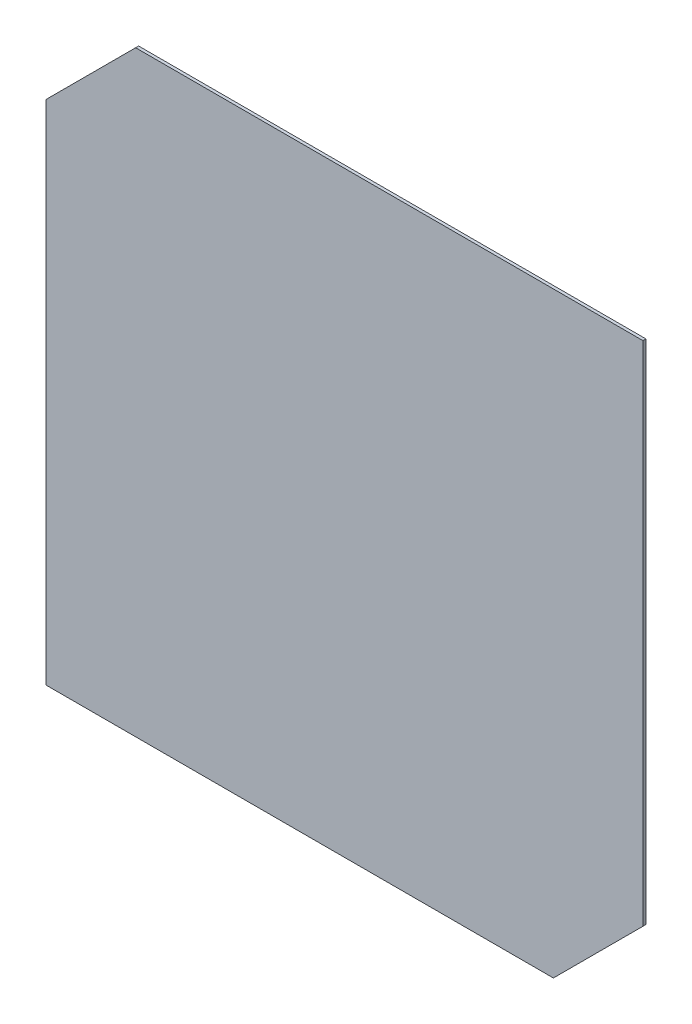
ISO-10303-21;
HEADER;
FILE_DESCRIPTION(('STEP AP214'),'2;1');
FILE_NAME('part.step','',(''),(''),'','','');
FILE_SCHEMA(('AUTOMOTIVE_DESIGN { 1 0 10303 214 1 1 1 1 }'));
ENDSEC;
DATA;
#1=APPLICATION_CONTEXT('core data for automotive mechanical design processes');
#2=APPLICATION_PROTOCOL_DEFINITION('international standard','automotive_design',2000,#1);
#3=PRODUCT_CONTEXT('',#1,'mechanical');
#4=PRODUCT('Part','Part','',(#3));
#5=PRODUCT_RELATED_PRODUCT_CATEGORY('part','',(#4));
#6=PRODUCT_DEFINITION_FORMATION('','',#4);
#7=PRODUCT_DEFINITION_CONTEXT('part definition',#1,'design');
#8=PRODUCT_DEFINITION('design','',#6,#7);
#9=PRODUCT_DEFINITION_SHAPE('','',#8);
#10=(LENGTH_UNIT() NAMED_UNIT(*) SI_UNIT(.MILLI.,.METRE.));
#11=(NAMED_UNIT(*) PLANE_ANGLE_UNIT() SI_UNIT($,.RADIAN.));
#12=(NAMED_UNIT(*) SI_UNIT($,.STERADIAN.) SOLID_ANGLE_UNIT());
#13=UNCERTAINTY_MEASURE_WITH_UNIT(LENGTH_MEASURE(1.E-05),#10,'distance_accuracy_value','');
#14=(GEOMETRIC_REPRESENTATION_CONTEXT(3) GLOBAL_UNCERTAINTY_ASSIGNED_CONTEXT((#13)) GLOBAL_UNIT_ASSIGNED_CONTEXT((#10,
#11,#12)) REPRESENTATION_CONTEXT('',''));
#15=CARTESIAN_POINT('',(0.,0.,0.));
#16=DIRECTION('',(0.,0.,1.));
#17=DIRECTION('',(1.,0.,0.));
#18=AXIS2_PLACEMENT_3D('',#15,#16,#17);
#19=CARTESIAN_POINT('',(1.5,2.,12.7));
#20=DIRECTION('',(0.,0.,-1.));
#21=DIRECTION('',(-1.,0.,0.));
#22=AXIS2_PLACEMENT_3D('',#19,#20,#21);
#23=PLANE('',#22);
#24=DIRECTION('',(0.,1.,0.));
#25=VECTOR('',#24,1.);
#26=CARTESIAN_POINT('',(11.5,12.,12.7));
#27=LINE('',#26,#25);
#28=CARTESIAN_POINT('',(11.5,-5.,12.7));
#29=VERTEX_POINT('',#28);
#30=CARTESIAN_POINT('',(11.5,12.,12.7));
#31=VERTEX_POINT('',#30);
#32=EDGE_CURVE('E94',#29,#31,#27,.T.);
#33=ORIENTED_EDGE('',*,*,#32,.F.);
#34=DIRECTION('',(0.707106781186547,0.707106781186548,0.));
#35=VECTOR('',#34,1.);
#36=CARTESIAN_POINT('',(11.5,-5.,12.7));
#37=LINE('',#36,#35);
#38=CARTESIAN_POINT('',(8.5,-8.,12.7));
#39=VERTEX_POINT('',#38);
#40=EDGE_CURVE('E98',#39,#29,#37,.T.);
#41=ORIENTED_EDGE('',*,*,#40,.F.);
#42=DIRECTION('',(1.,0.,0.));
#43=VECTOR('',#42,1.);
#44=CARTESIAN_POINT('',(8.5,-8.,12.7));
#45=LINE('',#44,#43);
#46=CARTESIAN_POINT('',(-8.5,-8.,12.7));
#47=VERTEX_POINT('',#46);
#48=EDGE_CURVE('E83',#47,#39,#45,.T.);
#49=ORIENTED_EDGE('',*,*,#48,.F.);
#50=DIRECTION('',(0.,-1.,0.));
#51=VECTOR('',#50,1.);
#52=CARTESIAN_POINT('',(-8.5,-8.,12.7));
#53=LINE('',#52,#51);
#54=CARTESIAN_POINT('',(-8.5,9.,12.7));
#55=VERTEX_POINT('',#54);
#56=EDGE_CURVE('E20',#55,#47,#53,.T.);
#57=ORIENTED_EDGE('',*,*,#56,.F.);
#58=DIRECTION('',(-0.707106781186547,-0.707106781186548,0.));
#59=VECTOR('',#58,1.);
#60=CARTESIAN_POINT('',(-8.5,9.,12.7));
#61=LINE('',#60,#59);
#62=CARTESIAN_POINT('',(-5.5,12.,12.7));
#63=VERTEX_POINT('',#62);
#64=EDGE_CURVE('E71',#63,#55,#61,.T.);
#65=ORIENTED_EDGE('',*,*,#64,.F.);
#66=DIRECTION('',(-1.,0.,0.));
#67=VECTOR('',#66,1.);
#68=CARTESIAN_POINT('',(-5.5,12.,12.7));
#69=LINE('',#68,#67);
#70=EDGE_CURVE('E66',#31,#63,#69,.T.);
#71=ORIENTED_EDGE('',*,*,#70,.F.);
#72=EDGE_LOOP('',(#33,#41,#49,#57,#65,#71));
#73=FACE_BOUND('',#72,.T.);
#74=ADVANCED_FACE('F17',(#73),#23,.T.);
#75=CARTESIAN_POINT('',(-8.5,-8.,12.8));
#76=DIRECTION('',(-1.,0.,0.));
#77=DIRECTION('',(0.,-1.,0.));
#78=AXIS2_PLACEMENT_3D('',#75,#76,#77);
#79=PLANE('',#78);
#80=DIRECTION('',(0.,1.,0.));
#81=VECTOR('',#80,1.);
#82=CARTESIAN_POINT('',(-8.5,2.,12.8));
#83=LINE('',#82,#81);
#84=CARTESIAN_POINT('',(-8.5,-8.,12.8));
#85=VERTEX_POINT('',#84);
#86=CARTESIAN_POINT('',(-8.5,9.,12.8));
#87=VERTEX_POINT('',#86);
#88=EDGE_CURVE('E89',#85,#87,#83,.T.);
#89=ORIENTED_EDGE('',*,*,#88,.T.);
#90=DIRECTION('',(0.,0.,1.));
#91=VECTOR('',#90,1.);
#92=CARTESIAN_POINT('',(-8.5,9.,12.8));
#93=LINE('',#92,#91);
#94=EDGE_CURVE('E76',#55,#87,#93,.T.);
#95=ORIENTED_EDGE('',*,*,#94,.F.);
#96=ORIENTED_EDGE('',*,*,#56,.T.);
#97=DIRECTION('',(0.,0.,1.));
#98=VECTOR('',#97,1.);
#99=CARTESIAN_POINT('',(-8.5,-8.00000000000001,12.8));
#100=LINE('',#99,#98);
#101=EDGE_CURVE('E104',#85,#47,#100,.F.);
#102=ORIENTED_EDGE('',*,*,#101,.F.);
#103=EDGE_LOOP('',(#89,#95,#96,#102));
#104=FACE_BOUND('',#103,.T.);
#105=ADVANCED_FACE('F88',(#104),#79,.T.);
#106=CARTESIAN_POINT('',(-8.5,9.,12.8));
#107=DIRECTION('',(-0.707106781186548,0.707106781186547,0.));
#108=DIRECTION('',(-0.707106781186547,-0.707106781186548,0.));
#109=AXIS2_PLACEMENT_3D('',#106,#107,#108);
#110=PLANE('',#109);
#111=DIRECTION('',(0.707106781186547,0.707106781186547,0.));
#112=VECTOR('',#111,1.);
#113=CARTESIAN_POINT('',(-8.5,9.,12.8));
#114=LINE('',#113,#112);
#115=CARTESIAN_POINT('',(-5.5,12.,12.8));
#116=VERTEX_POINT('',#115);
#117=EDGE_CURVE('E107',#87,#116,#114,.T.);
#118=ORIENTED_EDGE('',*,*,#117,.T.);
#119=DIRECTION('',(0.,0.,1.));
#120=VECTOR('',#119,1.);
#121=CARTESIAN_POINT('',(-5.5,12.,12.8));
#122=LINE('',#121,#120);
#123=EDGE_CURVE('E78',#63,#116,#122,.T.);
#124=ORIENTED_EDGE('',*,*,#123,.F.);
#125=ORIENTED_EDGE('',*,*,#64,.T.);
#126=ORIENTED_EDGE('',*,*,#94,.T.);
#127=EDGE_LOOP('',(#118,#124,#125,#126));
#128=FACE_BOUND('',#127,.T.);
#129=ADVANCED_FACE('F74',(#128),#110,.T.);
#130=CARTESIAN_POINT('',(-5.5,12.,12.8));
#131=DIRECTION('',(0.,1.,0.));
#132=DIRECTION('',(-1.,0.,0.));
#133=AXIS2_PLACEMENT_3D('',#130,#131,#132);
#134=PLANE('',#133);
#135=DIRECTION('',(-1.,0.,0.));
#136=VECTOR('',#135,1.);
#137=CARTESIAN_POINT('',(1.5,12.,12.8));
#138=LINE('',#137,#136);
#139=CARTESIAN_POINT('',(11.5,12.,12.8));
#140=VERTEX_POINT('',#139);
#141=EDGE_CURVE('E109',#116,#140,#138,.F.);
#142=ORIENTED_EDGE('',*,*,#141,.T.);
#143=DIRECTION('',(0.,0.,1.));
#144=VECTOR('',#143,1.);
#145=CARTESIAN_POINT('',(11.5,12.,12.8));
#146=LINE('',#145,#144);
#147=EDGE_CURVE('E96',#31,#140,#146,.T.);
#148=ORIENTED_EDGE('',*,*,#147,.F.);
#149=ORIENTED_EDGE('',*,*,#70,.T.);
#150=ORIENTED_EDGE('',*,*,#123,.T.);
#151=EDGE_LOOP('',(#142,#148,#149,#150));
#152=FACE_BOUND('',#151,.T.);
#153=ADVANCED_FACE('F126',(#152),#134,.T.);
#154=CARTESIAN_POINT('',(11.5,12.,12.8));
#155=DIRECTION('',(1.,0.,0.));
#156=DIRECTION('',(0.,1.,0.));
#157=AXIS2_PLACEMENT_3D('',#154,#155,#156);
#158=PLANE('',#157);
#159=DIRECTION('',(0.,1.,0.));
#160=VECTOR('',#159,1.);
#161=CARTESIAN_POINT('',(11.5,2.,12.8));
#162=LINE('',#161,#160);
#163=CARTESIAN_POINT('',(11.5,-5.,12.8));
#164=VERTEX_POINT('',#163);
#165=EDGE_CURVE('E112',#140,#164,#162,.F.);
#166=ORIENTED_EDGE('',*,*,#165,.T.);
#167=DIRECTION('',(0.,0.,1.));
#168=VECTOR('',#167,1.);
#169=CARTESIAN_POINT('',(11.5,-5.,12.8));
#170=LINE('',#169,#168);
#171=EDGE_CURVE('E100',#29,#164,#170,.T.);
#172=ORIENTED_EDGE('',*,*,#171,.F.);
#173=ORIENTED_EDGE('',*,*,#32,.T.);
#174=ORIENTED_EDGE('',*,*,#147,.T.);
#175=EDGE_LOOP('',(#166,#172,#173,#174));
#176=FACE_BOUND('',#175,.T.);
#177=ADVANCED_FACE('F125',(#176),#158,.T.);
#178=CARTESIAN_POINT('',(11.5,-5.,12.8));
#179=DIRECTION('',(0.707106781186548,-0.707106781186547,0.));
#180=DIRECTION('',(0.707106781186547,0.707106781186548,0.));
#181=AXIS2_PLACEMENT_3D('',#178,#179,#180);
#182=PLANE('',#181);
#183=DIRECTION('',(-0.707106781186547,-0.707106781186548,0.));
#184=VECTOR('',#183,1.);
#185=CARTESIAN_POINT('',(11.5,-5.,12.8));
#186=LINE('',#185,#184);
#187=CARTESIAN_POINT('',(8.5,-8.,12.8));
#188=VERTEX_POINT('',#187);
#189=EDGE_CURVE('E26',#164,#188,#186,.T.);
#190=ORIENTED_EDGE('',*,*,#189,.T.);
#191=DIRECTION('',(0.,0.,1.));
#192=VECTOR('',#191,1.);
#193=CARTESIAN_POINT('',(8.5,-8.,12.8));
#194=LINE('',#193,#192);
#195=EDGE_CURVE('E34',#39,#188,#194,.T.);
#196=ORIENTED_EDGE('',*,*,#195,.F.);
#197=ORIENTED_EDGE('',*,*,#40,.T.);
#198=ORIENTED_EDGE('',*,*,#171,.T.);
#199=EDGE_LOOP('',(#190,#196,#197,#198));
#200=FACE_BOUND('',#199,.T.);
#201=ADVANCED_FACE('F118',(#200),#182,.T.);
#202=CARTESIAN_POINT('',(8.5,-8.,12.8));
#203=DIRECTION('',(0.,-1.,0.));
#204=DIRECTION('',(1.,0.,0.));
#205=AXIS2_PLACEMENT_3D('',#202,#203,#204);
#206=PLANE('',#205);
#207=DIRECTION('',(-1.,0.,0.));
#208=VECTOR('',#207,1.);
#209=CARTESIAN_POINT('',(1.5,-8.,12.8));
#210=LINE('',#209,#208);
#211=EDGE_CURVE('E11',#188,#85,#210,.T.);
#212=ORIENTED_EDGE('',*,*,#211,.T.);
#213=ORIENTED_EDGE('',*,*,#101,.T.);
#214=ORIENTED_EDGE('',*,*,#48,.T.);
#215=ORIENTED_EDGE('',*,*,#195,.T.);
#216=EDGE_LOOP('',(#212,#213,#214,#215));
#217=FACE_BOUND('',#216,.T.);
#218=ADVANCED_FACE('F127',(#217),#206,.T.);
#219=CARTESIAN_POINT('',(1.5,2.,12.8));
#220=DIRECTION('',(0.,0.,-1.));
#221=DIRECTION('',(-1.,0.,0.));
#222=AXIS2_PLACEMENT_3D('',#219,#220,#221);
#223=PLANE('',#222);
#224=ORIENTED_EDGE('',*,*,#189,.F.);
#225=ORIENTED_EDGE('',*,*,#165,.F.);
#226=ORIENTED_EDGE('',*,*,#141,.F.);
#227=ORIENTED_EDGE('',*,*,#117,.F.);
#228=ORIENTED_EDGE('',*,*,#88,.F.);
#229=ORIENTED_EDGE('',*,*,#211,.F.);
#230=EDGE_LOOP('',(#224,#225,#226,#227,#228,#229));
#231=FACE_BOUND('',#230,.T.);
#232=ADVANCED_FACE('F122',(#231),#223,.F.);
#233=CLOSED_SHELL('',(#74,#105,#129,#153,#177,#201,#218,#232));
#234=MANIFOLD_SOLID_BREP('B1',#233);
#235=ADVANCED_BREP_SHAPE_REPRESENTATION('',(#18,#234),#14);
#236=SHAPE_DEFINITION_REPRESENTATION(#9,#235);
ENDSEC;
END-ISO-10303-21;
